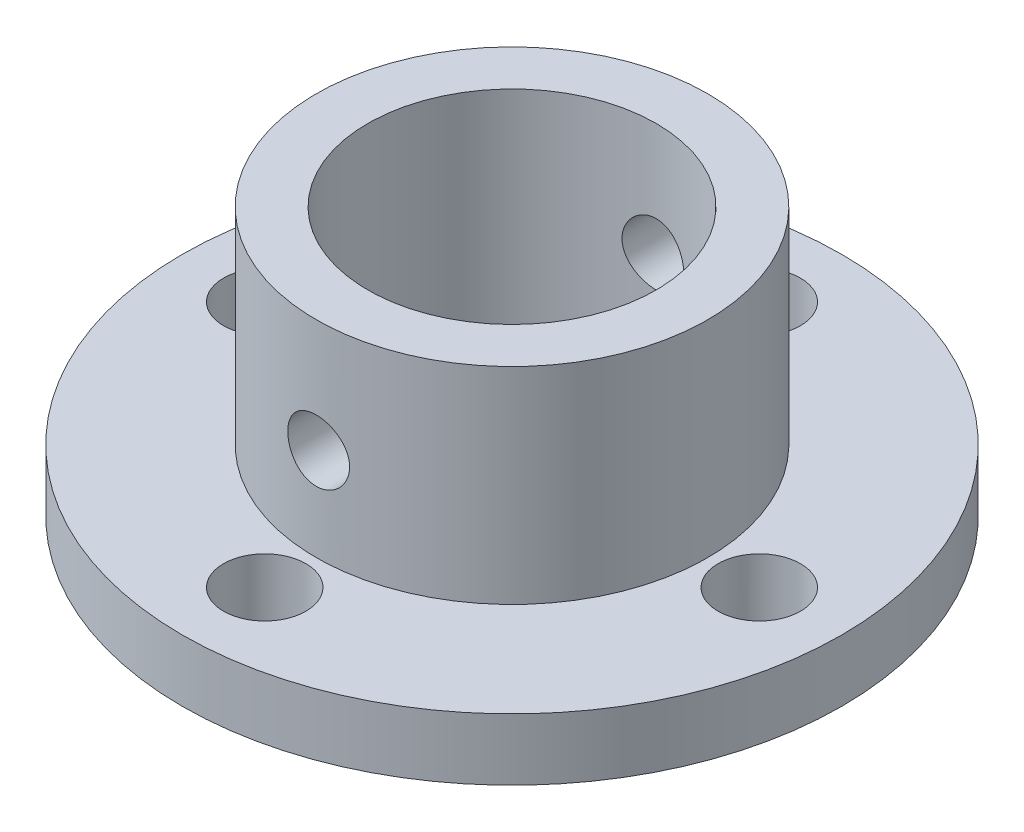
ISO-10303-21;
HEADER;
FILE_DESCRIPTION(('STEP AP214'),'2;1');
FILE_NAME('part.step','',(''),(''),'','','');
FILE_SCHEMA(('AUTOMOTIVE_DESIGN { 1 0 10303 214 1 1 1 1 }'));
ENDSEC;
DATA;
#1=APPLICATION_CONTEXT('core data for automotive mechanical design processes');
#2=APPLICATION_PROTOCOL_DEFINITION('international standard','automotive_design',2000,#1);
#3=PRODUCT_CONTEXT('',#1,'mechanical');
#4=PRODUCT('Part','Part','',(#3));
#5=PRODUCT_RELATED_PRODUCT_CATEGORY('part','',(#4));
#6=PRODUCT_DEFINITION_FORMATION('','',#4);
#7=PRODUCT_DEFINITION_CONTEXT('part definition',#1,'design');
#8=PRODUCT_DEFINITION('design','',#6,#7);
#9=PRODUCT_DEFINITION_SHAPE('','',#8);
#10=(LENGTH_UNIT() NAMED_UNIT(*) SI_UNIT(.MILLI.,.METRE.));
#11=(NAMED_UNIT(*) PLANE_ANGLE_UNIT() SI_UNIT($,.RADIAN.));
#12=(NAMED_UNIT(*) SI_UNIT($,.STERADIAN.) SOLID_ANGLE_UNIT());
#13=UNCERTAINTY_MEASURE_WITH_UNIT(LENGTH_MEASURE(1.E-05),#10,'distance_accuracy_value','');
#14=(GEOMETRIC_REPRESENTATION_CONTEXT(3) GLOBAL_UNCERTAINTY_ASSIGNED_CONTEXT((#13)) GLOBAL_UNIT_ASSIGNED_CONTEXT((#10,
#11,#12)) REPRESENTATION_CONTEXT('',''));
#15=CARTESIAN_POINT('',(0.,0.,0.));
#16=DIRECTION('',(0.,0.,1.));
#17=DIRECTION('',(1.,0.,0.));
#18=AXIS2_PLACEMENT_3D('',#15,#16,#17);
#19=CARTESIAN_POINT('',(0.,0.,0.));
#20=DIRECTION('',(0.,-1.,0.));
#21=DIRECTION('',(0.,0.,-1.));
#22=AXIS2_PLACEMENT_3D('',#19,#20,#21);
#23=CYLINDRICAL_SURFACE('',#22,7.);
#24=CARTESIAN_POINT('',(0.,9.,-7.));
#25=CARTESIAN_POINT('',(0.0832358860906165,8.9999971004257,-6.99999846043226));
#26=CARTESIAN_POINT('',(0.166507195600274,8.99304839161214,-6.9985002594971));
#27=CARTESIAN_POINT('',(0.330687344293327,8.96546434314641,-6.99266829827727));
#28=CARTESIAN_POINT('',(0.41159440357119,8.94481895580507,-6.98833245637099));
#29=CARTESIAN_POINT('',(0.568649323817737,8.89051563539197,-6.97730831788826));
#30=CARTESIAN_POINT('',(0.644801963446556,8.85687102061868,-6.97062242967171));
#31=CARTESIAN_POINT('',(0.790378177960787,8.77756591382874,-6.95562106817971));
#32=CARTESIAN_POINT('',(0.859801981747369,8.73190583075006,-6.9473056503666));
#33=CARTESIAN_POINT('',(0.991024790535229,8.62911970032649,-6.92981369246311));
#34=CARTESIAN_POINT('',(1.05270503419445,8.57184377810147,-6.92062683143259));
#35=CARTESIAN_POINT('',(1.16566042389435,8.4477736843148,-6.90250069814144));
#36=CARTESIAN_POINT('',(1.21693467150908,8.38097869174874,-6.8935614473163));
#37=CARTESIAN_POINT('',(1.30814204379808,8.23889424713957,-6.87684116047225));
#38=CARTESIAN_POINT('',(1.34794958335009,8.16352248224379,-6.8690733634436));
#39=CARTESIAN_POINT('',(1.41428823691148,8.00696554623316,-6.85572325558537));
#40=CARTESIAN_POINT('',(1.44082087001716,7.92578104150743,-6.85014069470711));
#41=CARTESIAN_POINT('',(1.47946574422454,7.76118891341193,-6.8418980892631));
#42=CARTESIAN_POINT('',(1.49178779748342,7.67783272433614,-6.83919556896486));
#43=CARTESIAN_POINT('',(1.50231395206577,7.51019576749301,-6.83689139845106));
#44=CARTESIAN_POINT('',(1.50051971664629,7.42591510982005,-6.83728938291729));
#45=CARTESIAN_POINT('',(1.48303326340861,7.26037531206621,-6.84110276603832));
#46=CARTESIAN_POINT('',(1.46758398649408,7.17908911089985,-6.84446541682162));
#47=CARTESIAN_POINT('',(1.42361054298677,7.02028975971066,-6.85374593375788));
#48=CARTESIAN_POINT('',(1.39508566936466,6.94277681396768,-6.85966393808402));
#49=CARTESIAN_POINT('',(1.32554551075991,6.79303712712666,-6.87344080755724));
#50=CARTESIAN_POINT('',(1.2844361097283,6.72085548728745,-6.88131420983365));
#51=CARTESIAN_POINT('',(1.19096007283993,6.58432483504204,-6.89810572501288));
#52=CARTESIAN_POINT('',(1.13859196103562,6.5199768513138,-6.90702397481896));
#53=CARTESIAN_POINT('',(1.0227954275532,6.3995406443266,-6.92512718393878));
#54=CARTESIAN_POINT('',(0.95916023396441,6.34365129341526,-6.93431383972178));
#55=CARTESIAN_POINT('',(0.823317306269097,6.24330626631034,-6.95175017497059));
#56=CARTESIAN_POINT('',(0.751109428775401,6.19885078139961,-6.95999983875972));
#57=CARTESIAN_POINT('',(0.59993346204996,6.12258932009307,-6.97465778534003));
#58=CARTESIAN_POINT('',(0.520952258863483,6.09080858742202,-6.98106238643354));
#59=CARTESIAN_POINT('',(0.358603146685707,6.04102435167891,-6.99128109245334));
#60=CARTESIAN_POINT('',(0.27523585113367,6.02301892743668,-6.99509555860384));
#61=CARTESIAN_POINT('',(0.10818767083663,6.00158378585658,-6.99965306347808));
#62=CARTESIAN_POINT('',(0.0245431772716159,5.99788228711822,-7.00045336521066));
#63=CARTESIAN_POINT('',(-0.142168973650404,6.00442457112516,-6.99905248935969));
#64=CARTESIAN_POINT('',(-0.225236668127254,6.01466744796294,-6.99685150675698));
#65=CARTESIAN_POINT('',(-0.387542537982805,6.0485822436617,-6.98973143045266));
#66=CARTESIAN_POINT('',(-0.466811712908476,6.07211236947253,-6.98484105045459));
#67=CARTESIAN_POINT('',(-0.620278450473417,6.13177694299482,-6.9728892442151));
#68=CARTESIAN_POINT('',(-0.694475592587739,6.16791243431165,-6.96582763822237));
#69=CARTESIAN_POINT('',(-0.836821397964753,6.25233354306033,-6.950175043904));
#70=CARTESIAN_POINT('',(-0.904872575111139,6.30077979490973,-6.94156431354275));
#71=CARTESIAN_POINT('',(-1.03197692552359,6.40823482488874,-6.92381033034847));
#72=CARTESIAN_POINT('',(-1.091028978692,6.46724491588744,-6.91466701142097));
#73=CARTESIAN_POINT('',(-1.19952711057989,6.59539737018713,-6.89668172706324));
#74=CARTESIAN_POINT('',(-1.24878537255156,6.6647000992221,-6.88784792221285));
#75=CARTESIAN_POINT('',(-1.3349641538604,6.81075459647799,-6.87166654559681));
#76=CARTESIAN_POINT('',(-1.37188519913706,6.88750604697749,-6.86431891048055));
#77=CARTESIAN_POINT('',(-1.43209741248548,7.0458722989946,-6.8520100980739));
#78=CARTESIAN_POINT('',(-1.45546398641275,7.12745735643067,-6.84703574582967));
#79=CARTESIAN_POINT('',(-1.48812696085335,7.29351558383364,-6.84001186708418));
#80=CARTESIAN_POINT('',(-1.49742550780258,7.37798831120132,-6.83796189439706));
#81=CARTESIAN_POINT('',(-1.5015999992604,7.54553234317524,-6.83704618848155));
#82=CARTESIAN_POINT('',(-1.49677347258311,7.62859601498058,-6.83811476518543));
#83=CARTESIAN_POINT('',(-1.47349789406331,7.79269724213259,-6.8431676318483));
#84=CARTESIAN_POINT('',(-1.45504898957979,7.87373481938657,-6.84715189026714));
#85=CARTESIAN_POINT('',(-1.40519345940434,8.03125865786916,-6.85755581104157));
#86=CARTESIAN_POINT('',(-1.37382847170887,8.10775864866429,-6.86396764224703));
#87=CARTESIAN_POINT('',(-1.29906751595601,8.25445537250685,-6.87850764590649));
#88=CARTESIAN_POINT('',(-1.255670353015,8.32465147861504,-6.88663598880362));
#89=CARTESIAN_POINT('',(-1.15708290349304,8.45821819372536,-6.90389055593232));
#90=CARTESIAN_POINT('',(-1.10167987421237,8.52142969594697,-6.91303309938926));
#91=CARTESIAN_POINT('',(-0.981086554619622,8.63775626252046,-6.93117449799694));
#92=CARTESIAN_POINT('',(-0.915894009385598,8.6908689943122,-6.94017331951296));
#93=CARTESIAN_POINT('',(-0.776603147268718,8.78611595950556,-6.95714491048987));
#94=CARTESIAN_POINT('',(-0.702404846009642,8.82810660623098,-6.96510364570626));
#95=CARTESIAN_POINT('',(-0.547850160940599,8.89895452890618,-6.97895826104019));
#96=CARTESIAN_POINT('',(-0.467499105863881,8.92782302258503,-6.98485590212342));
#97=CARTESIAN_POINT('',(-0.322535217553205,8.96635218513115,-6.99284848461772));
#98=CARTESIAN_POINT('',(-0.25871720554598,8.97894643398003,-6.99551391888263));
#99=CARTESIAN_POINT('',(-0.129939960853847,8.99577130171166,-6.99909024154719));
#100=CARTESIAN_POINT('',(-0.0649807750887453,9.00000226364606,-7.00000120191314));
#101=CARTESIAN_POINT('',(0.,9.,-7.));
#102=B_SPLINE_CURVE_WITH_KNOTS('',3,(#24,#25,#26,#27,#28,#29,#30,#31,#32,#33,#34,#35,#36,#37,
#38,#39,#40,#41,#42,#43,#44,#45,#46,#47,#48,#49,#50,#51,#52,#53,#54,#55,#56,#57,#58,#59,#60,#61,
#62,#63,#64,#65,#66,#67,#68,#69,#70,#71,#72,#73,#74,#75,#76,#77,#78,#79,#80,#81,#82,#83,#84,#85,
#86,#87,#88,#89,#90,#91,#92,#93,#94,#95,#96,#97,#98,#99,#100,#101),.UNSPECIFIED.,.T.,.F.,(4,2,2,
2,2,2,2,2,2,2,2,2,2,2,2,2,2,2,2,2,2,2,2,2,2,2,2,2,2,2,2,2,2,2,2,2,2,2,4),(0.,0.249469836512082,
0.499122883219935,0.748520824425602,0.997910278645886,1.25074961881732,1.50361077918506,
1.7591442921451,2.0146485567749,2.26633008124666,2.51798195169165,2.76524475452927,
3.01252092904568,3.26169356165968,3.51089887920889,3.76527011050291,4.0196455970235,
4.27452521139806,4.52936927256343,4.77934665704185,5.02930780231429,5.27665060589267,
5.52401389198434,5.77478733867803,6.02559197304485,6.28082063283534,6.53603841075805,
6.78982240408475,7.04356767229185,7.29200680540294,7.5404432510827,7.78808499706785,
8.03575134451623,8.28822950154113,8.54076590397115,8.79641910357222,9.0518533401027,
9.24661799132293,9.44137465337336),.UNSPECIFIED.);
#103=CARTESIAN_POINT('',(0.,9.,-7.));
#104=VERTEX_POINT('',#103);
#105=EDGE_CURVE('E102',#104,#104,#102,.T.);
#106=ORIENTED_EDGE('',*,*,#105,.T.);
#107=EDGE_LOOP('',(#106));
#108=FACE_BOUND('',#107,.T.);
#109=CARTESIAN_POINT('',(1.5,7.5,6.83739716558867));
#110=CARTESIAN_POINT('',(1.49999708238613,7.58321115248195,6.83739884558951));
#111=CARTESIAN_POINT('',(1.49305236244768,7.66645777394212,6.83893272341929));
#112=CARTESIAN_POINT('',(1.46548559252999,7.83058667224201,6.84489178429867));
#113=CARTESIAN_POINT('',(1.44485339653622,7.91146714867621,6.84931911211841));
#114=CARTESIAN_POINT('',(1.39058863684599,8.0684657495742,6.86054115293409));
#115=CARTESIAN_POINT('',(1.35697000991314,8.14458887812147,6.86733332725825));
#116=CARTESIAN_POINT('',(1.27772617673341,8.29011527394461,6.88251670848644));
#117=CARTESIAN_POINT('',(1.23210132048776,8.35951873702908,6.89090786877545));
#118=CARTESIAN_POINT('',(1.12935142570221,8.49076296148212,6.90849578796654));
#119=CARTESIAN_POINT('',(1.07206859483983,8.55247887623996,6.91770249871753));
#120=CARTESIAN_POINT('',(0.947969508129577,8.66550355440578,6.93579691710397));
#121=CARTESIAN_POINT('',(0.881152530217675,8.71681152886007,6.94468460051416));
#122=CARTESIAN_POINT('',(0.739047288464581,8.80805544449143,6.96124769109432));
#123=CARTESIAN_POINT('',(0.663680488229954,8.84787165577062,6.96890998819429));
#124=CARTESIAN_POINT('',(0.507134269342596,8.91422769144629,6.98204671042933));
#125=CARTESIAN_POINT('',(0.425955477380312,8.94076894478628,6.98752137103329));
#126=CARTESIAN_POINT('',(0.261387187671512,8.97942997093134,6.9955956528118));
#127=CARTESIAN_POINT('',(0.178049400596924,8.99176092855243,6.99823733378385));
#128=CARTESIAN_POINT('',(0.010448945306645,9.00231127731326,7.00049362207002));
#129=CARTESIAN_POINT('',(-0.073813620164759,9.00053222056076,7.00010856232698));
#130=CARTESIAN_POINT('',(-0.239417029250511,8.98307103533642,6.99638700862558));
#131=CARTESIAN_POINT('',(-0.320783115362112,8.96761649971008,6.99309883152432));
#132=CARTESIAN_POINT('',(-0.479739463978388,8.92360531814814,6.98399541589104));
#133=CARTESIAN_POINT('',(-0.557329560175054,8.89504809570026,6.97818006616518));
#134=CARTESIAN_POINT('',(-0.707167497556552,8.82543854111148,6.96459754646858));
#135=CARTESIAN_POINT('',(-0.779373657015788,8.78429923279565,6.95681685803946));
#136=CARTESIAN_POINT('',(-0.915940926562845,8.6907580318364,6.94015793743865));
#137=CARTESIAN_POINT('',(-0.980301006451528,8.6383546626997,6.93127956144693));
#138=CARTESIAN_POINT('',(-1.10070208800198,8.52253145547214,6.91319326460925));
#139=CARTESIAN_POINT('',(-1.1565511732025,8.45891242064297,6.90398230372853));
#140=CARTESIAN_POINT('',(-1.25682243234728,8.32311671493149,6.88643566831974));
#141=CARTESIAN_POINT('',(-1.30124432118068,8.25093983059475,6.87810001563386));
#142=CARTESIAN_POINT('',(-1.37748077573296,8.09977549893624,6.86324023586723));
#143=CARTESIAN_POINT('',(-1.40926035088923,8.02076987614756,6.85672115127775));
#144=CARTESIAN_POINT('',(-1.45903495159115,7.85836723405356,6.84630340806616));
#145=CARTESIAN_POINT('',(-1.47703206694628,7.77497088255681,6.84240435218483));
#146=CARTESIAN_POINT('',(-1.49843586024652,7.60790424735029,6.83774881255446));
#147=CARTESIAN_POINT('',(-1.5021214192864,7.5242713249227,6.83693227051701));
#148=CARTESIAN_POINT('',(-1.49555139642373,7.3575860068183,6.83837239573993));
#149=CARTESIAN_POINT('',(-1.48529673081635,7.27453357334645,6.84062886101063));
#150=CARTESIAN_POINT('',(-1.45137894635584,7.11232956501924,6.84790415484205));
#151=CARTESIAN_POINT('',(-1.42786830251553,7.03314456740304,6.85289155274364));
#152=CARTESIAN_POINT('',(-1.3682705294675,6.87983766246708,6.86503859869777));
#153=CARTESIAN_POINT('',(-1.33218223662818,6.80571622436581,6.87219844772849));
#154=CARTESIAN_POINT('',(-1.24783504416705,6.66343031524108,6.88801634080345));
#155=CARTESIAN_POINT('',(-1.19940368590792,6.59537041798781,6.89669501746317));
#156=CARTESIAN_POINT('',(-1.09197183833601,6.4682416541262,6.91451775360139));
#157=CARTESIAN_POINT('',(-1.03297009182161,6.40917385855153,6.92366186834461));
#158=CARTESIAN_POINT('',(-0.904812764420814,6.30062969705524,6.94158239990173));
#159=CARTESIAN_POINT('',(-0.835494925828771,6.25134308384299,6.95034935607746));
#160=CARTESIAN_POINT('',(-0.689401481282276,6.16511459064895,6.96635610714901));
#161=CARTESIAN_POINT('',(-0.61262621604374,6.12817214702717,6.97359597176692));
#162=CARTESIAN_POINT('',(-0.45426541898204,6.06794794536152,6.98569278381574));
#163=CARTESIAN_POINT('',(-0.372713193075173,6.04458169625372,6.99056443803698));
#164=CARTESIAN_POINT('',(-0.20672517700329,6.01190829426768,6.9974393930198));
#165=CARTESIAN_POINT('',(-0.122289789973994,6.00259918402609,6.99944309312296));
#166=CARTESIAN_POINT('',(0.0452637170528282,5.99838934758814,7.00034511009056));
#167=CARTESIAN_POINT('',(0.128374505509229,6.00320484139538,6.99930459001667));
#168=CARTESIAN_POINT('',(0.29257293841596,6.02647476351903,6.99436552363383));
#169=CARTESIAN_POINT('',(0.373660616405284,6.04492896557832,6.99046702473686));
#170=CARTESIAN_POINT('',(0.531301948487269,6.09481880624949,6.98025388638537));
#171=CARTESIAN_POINT('',(0.607868365073177,6.12621568938556,6.97394646430492));
#172=CARTESIAN_POINT('',(0.754684956723219,6.20106127116912,6.9595903605066));
#173=CARTESIAN_POINT('',(0.82493454479614,6.24451108830603,6.9515415172034));
#174=CARTESIAN_POINT('',(0.958512306895242,6.34316231874267,6.93439809934493));
#175=CARTESIAN_POINT('',(1.02169036510577,6.39856415832131,6.92528708907874));
#176=CARTESIAN_POINT('',(1.13795001457643,6.51914061025035,6.90713690075836));
#177=CARTESIAN_POINT('',(1.19102918062422,6.5843175633556,6.89809774045682));
#178=CARTESIAN_POINT('',(1.28623261596675,6.72359049318567,6.88098693651915));
#179=CARTESIAN_POINT('',(1.32820897809616,6.79778935828702,6.87292905956533));
#180=CARTESIAN_POINT('',(1.39903004659825,6.95234372092325,6.85886497228049));
#181=CARTESIAN_POINT('',(1.42788606423931,7.03269384525307,6.85285699581573));
#182=CARTESIAN_POINT('',(1.46638607121557,7.17762613118586,6.84470560641996));
#183=CARTESIAN_POINT('',(1.47896752507743,7.24141167570783,6.84198283087953));
#184=CARTESIAN_POINT('',(1.49577544043437,7.37012431157732,6.83832799504405));
#185=CARTESIAN_POINT('',(1.50000227727981,7.43505135150832,6.83739585430069));
#186=CARTESIAN_POINT('',(1.5,7.5,6.83739716558867));
#187=B_SPLINE_CURVE_WITH_KNOTS('',3,(#109,#110,#111,#112,#113,#114,#115,#116,#117,#118,#119,
#120,#121,#122,#123,#124,#125,#126,#127,#128,#129,#130,#131,#132,#133,#134,#135,#136,#137,#138,
#139,#140,#141,#142,#143,#144,#145,#146,#147,#148,#149,#150,#151,#152,#153,#154,#155,#156,#157,
#158,#159,#160,#161,#162,#163,#164,#165,#166,#167,#168,#169,#170,#171,#172,#173,#174,#175,#176,
#177,#178,#179,#180,#181,#182,#183,#184,#185,#186),.UNSPECIFIED.,.T.,.F.,(4,2,2,2,2,2,2,2,2,2,2,
2,2,2,2,2,2,2,2,2,2,2,2,2,2,2,2,2,2,2,2,2,2,2,2,2,2,2,4),(0.,0.249395482027528,
0.498976038479964,0.748289491152758,0.997595676735284,1.25053229582692,1.50348808112879,
1.75899134820278,2.01446710646267,2.26609508151929,2.51769537777241,2.76518557667371,
3.01268666607584,3.26193888143437,3.51122378872315,3.76548960779295,4.01976177023092,
4.27473287411781,4.52966530953839,4.77960433192523,5.02952692653917,5.27663180749375,
5.5237595556315,5.77455010216318,6.02537049659078,6.2806621468321,6.53594213875541,
6.78961589824375,7.04325433208539,7.29183199644127,7.540405537151,7.78824009619483,
8.03609766151365,8.28848914160965,8.54094115631233,8.79660380167249,9.05204561611687,
9.24671456122272,9.44137476018023),.UNSPECIFIED.);
#188=CARTESIAN_POINT('',(1.5,7.5,6.83739716558867));
#189=VERTEX_POINT('',#188);
#190=EDGE_CURVE('E95',#189,#189,#187,.T.);
#191=ORIENTED_EDGE('',*,*,#190,.T.);
#192=EDGE_LOOP('',(#191));
#193=FACE_BOUND('',#192,.T.);
#194=CARTESIAN_POINT('',(0.,13.,0.));
#195=DIRECTION('',(0.,-1.,0.));
#196=DIRECTION('',(0.,0.,-1.));
#197=AXIS2_PLACEMENT_3D('',#194,#195,#196);
#198=CIRCLE('',#197,7.);
#199=CARTESIAN_POINT('',(0.,13.,-7.));
#200=VERTEX_POINT('',#199);
#201=EDGE_CURVE('E111',#200,#200,#198,.T.);
#202=ORIENTED_EDGE('',*,*,#201,.F.);
#203=EDGE_LOOP('',(#202));
#204=FACE_BOUND('',#203,.T.);
#205=CARTESIAN_POINT('',(0.,0.,0.));
#206=DIRECTION('',(0.,-1.,0.));
#207=DIRECTION('',(0.,0.,-1.));
#208=AXIS2_PLACEMENT_3D('',#205,#206,#207);
#209=CIRCLE('',#208,7.);
#210=CARTESIAN_POINT('',(0.,0.,-7.));
#211=VERTEX_POINT('',#210);
#212=EDGE_CURVE('E10',#211,#211,#209,.T.);
#213=ORIENTED_EDGE('',*,*,#212,.T.);
#214=EDGE_LOOP('',(#213));
#215=FACE_BOUND('',#214,.T.);
#216=ADVANCED_FACE('F43',(#108,#193,#204,#215),#23,.F.);
#217=CARTESIAN_POINT('',(0.,0.,7.));
#218=DIRECTION('',(0.,1.,0.));
#219=DIRECTION('',(0.,0.,1.));
#220=AXIS2_PLACEMENT_3D('',#217,#218,#219);
#221=PLANE('',#220);
#222=CARTESIAN_POINT('',(-12.,0.,0.));
#223=DIRECTION('',(0.,1.,0.));
#224=DIRECTION('',(-1.,0.,0.));
#225=AXIS2_PLACEMENT_3D('',#222,#223,#224);
#226=CIRCLE('',#225,2.);
#227=CARTESIAN_POINT('',(-14.,0.,0.));
#228=VERTEX_POINT('',#227);
#229=EDGE_CURVE('E249',#228,#228,#226,.T.);
#230=ORIENTED_EDGE('',*,*,#229,.T.);
#231=EDGE_LOOP('',(#230));
#232=FACE_BOUND('',#231,.T.);
#233=CARTESIAN_POINT('',(0.,0.,-12.));
#234=DIRECTION('',(0.,1.,0.));
#235=DIRECTION('',(0.,0.,-1.));
#236=AXIS2_PLACEMENT_3D('',#233,#234,#235);
#237=CIRCLE('',#236,2.);
#238=CARTESIAN_POINT('',(0.,0.,-14.));
#239=VERTEX_POINT('',#238);
#240=EDGE_CURVE('E276',#239,#239,#237,.T.);
#241=ORIENTED_EDGE('',*,*,#240,.T.);
#242=EDGE_LOOP('',(#241));
#243=FACE_BOUND('',#242,.T.);
#244=CARTESIAN_POINT('',(12.,0.,1.25693328198353E-13));
#245=DIRECTION('',(0.,1.,0.));
#246=DIRECTION('',(1.,0.,0.));
#247=AXIS2_PLACEMENT_3D('',#244,#245,#246);
#248=CIRCLE('',#247,2.);
#249=CARTESIAN_POINT('',(14.,0.,1.46642216231412E-13));
#250=VERTEX_POINT('',#249);
#251=EDGE_CURVE('E280',#250,#250,#248,.T.);
#252=ORIENTED_EDGE('',*,*,#251,.T.);
#253=EDGE_LOOP('',(#252));
#254=FACE_BOUND('',#253,.T.);
#255=CARTESIAN_POINT('',(0.,0.,12.));
#256=DIRECTION('',(0.,1.,0.));
#257=DIRECTION('',(0.,0.,1.));
#258=AXIS2_PLACEMENT_3D('',#255,#256,#257);
#259=CIRCLE('',#258,2.);
#260=CARTESIAN_POINT('',(0.,0.,14.));
#261=VERTEX_POINT('',#260);
#262=EDGE_CURVE('E103',#261,#261,#259,.T.);
#263=ORIENTED_EDGE('',*,*,#262,.T.);
#264=EDGE_LOOP('',(#263));
#265=FACE_BOUND('',#264,.T.);
#266=ORIENTED_EDGE('',*,*,#212,.F.);
#267=EDGE_LOOP('',(#266));
#268=FACE_BOUND('',#267,.T.);
#269=CARTESIAN_POINT('',(0.,0.,0.));
#270=DIRECTION('',(0.,-1.,0.));
#271=DIRECTION('',(0.,0.,-1.));
#272=AXIS2_PLACEMENT_3D('',#269,#270,#271);
#273=CIRCLE('',#272,16.);
#274=CARTESIAN_POINT('',(0.,0.,-16.));
#275=VERTEX_POINT('',#274);
#276=EDGE_CURVE('E52',#275,#275,#273,.T.);
#277=ORIENTED_EDGE('',*,*,#276,.T.);
#278=EDGE_LOOP('',(#277));
#279=FACE_BOUND('',#278,.T.);
#280=ADVANCED_FACE('F144',(#232,#243,#254,#265,#268,#279),#221,.F.);
#281=CARTESIAN_POINT('',(0.,0.,0.));
#282=DIRECTION('',(0.,-1.,0.));
#283=DIRECTION('',(0.,0.,-1.));
#284=AXIS2_PLACEMENT_3D('',#281,#282,#283);
#285=CYLINDRICAL_SURFACE('',#284,16.);
#286=ORIENTED_EDGE('',*,*,#276,.F.);
#287=EDGE_LOOP('',(#286));
#288=FACE_BOUND('',#287,.T.);
#289=CARTESIAN_POINT('',(0.,3.,0.));
#290=DIRECTION('',(0.,-1.,0.));
#291=DIRECTION('',(0.,0.,-1.));
#292=AXIS2_PLACEMENT_3D('',#289,#290,#291);
#293=CIRCLE('',#292,16.);
#294=CARTESIAN_POINT('',(0.,3.,-16.));
#295=VERTEX_POINT('',#294);
#296=EDGE_CURVE('E58',#295,#295,#293,.T.);
#297=ORIENTED_EDGE('',*,*,#296,.T.);
#298=EDGE_LOOP('',(#297));
#299=FACE_BOUND('',#298,.T.);
#300=ADVANCED_FACE('F126',(#288,#299),#285,.T.);
#301=CARTESIAN_POINT('',(0.,3.,16.));
#302=DIRECTION('',(0.,-1.,0.));
#303=DIRECTION('',(0.,0.,-1.));
#304=AXIS2_PLACEMENT_3D('',#301,#302,#303);
#305=PLANE('',#304);
#306=CARTESIAN_POINT('',(-12.,3.,0.));
#307=DIRECTION('',(0.,-1.,0.));
#308=DIRECTION('',(0.,0.,-1.));
#309=AXIS2_PLACEMENT_3D('',#306,#307,#308);
#310=CIRCLE('',#309,2.);
#311=CARTESIAN_POINT('',(-12.,3.,-2.00000000000004));
#312=VERTEX_POINT('',#311);
#313=EDGE_CURVE('E47',#312,#312,#310,.T.);
#314=ORIENTED_EDGE('',*,*,#313,.T.);
#315=EDGE_LOOP('',(#314));
#316=FACE_BOUND('',#315,.T.);
#317=CARTESIAN_POINT('',(0.,3.,-12.));
#318=DIRECTION('',(0.,-1.,0.));
#319=DIRECTION('',(0.,0.,-1.));
#320=AXIS2_PLACEMENT_3D('',#317,#318,#319);
#321=CIRCLE('',#320,2.);
#322=CARTESIAN_POINT('',(0.,3.,-14.));
#323=VERTEX_POINT('',#322);
#324=EDGE_CURVE('E253',#323,#323,#321,.T.);
#325=ORIENTED_EDGE('',*,*,#324,.T.);
#326=EDGE_LOOP('',(#325));
#327=FACE_BOUND('',#326,.T.);
#328=CARTESIAN_POINT('',(12.,3.,1.25693328198353E-13));
#329=DIRECTION('',(0.,-1.,0.));
#330=DIRECTION('',(0.,0.,-1.));
#331=AXIS2_PLACEMENT_3D('',#328,#329,#330);
#332=CIRCLE('',#331,2.);
#333=CARTESIAN_POINT('',(12.,3.,-1.99999999999987));
#334=VERTEX_POINT('',#333);
#335=EDGE_CURVE('E258',#334,#334,#332,.T.);
#336=ORIENTED_EDGE('',*,*,#335,.T.);
#337=EDGE_LOOP('',(#336));
#338=FACE_BOUND('',#337,.T.);
#339=CARTESIAN_POINT('',(0.,3.,12.));
#340=DIRECTION('',(0.,-1.,0.));
#341=DIRECTION('',(0.,0.,-1.));
#342=AXIS2_PLACEMENT_3D('',#339,#340,#341);
#343=CIRCLE('',#342,2.);
#344=CARTESIAN_POINT('',(0.,3.,10.));
#345=VERTEX_POINT('',#344);
#346=EDGE_CURVE('E72',#345,#345,#343,.T.);
#347=ORIENTED_EDGE('',*,*,#346,.T.);
#348=EDGE_LOOP('',(#347));
#349=FACE_BOUND('',#348,.T.);
#350=ORIENTED_EDGE('',*,*,#296,.F.);
#351=EDGE_LOOP('',(#350));
#352=FACE_BOUND('',#351,.T.);
#353=CARTESIAN_POINT('',(0.,3.,0.));
#354=DIRECTION('',(0.,-1.,0.));
#355=DIRECTION('',(0.,0.,-1.));
#356=AXIS2_PLACEMENT_3D('',#353,#354,#355);
#357=CIRCLE('',#356,9.5);
#358=CARTESIAN_POINT('',(0.,3.,-9.5));
#359=VERTEX_POINT('',#358);
#360=EDGE_CURVE('E119',#359,#359,#357,.T.);
#361=ORIENTED_EDGE('',*,*,#360,.T.);
#362=EDGE_LOOP('',(#361));
#363=FACE_BOUND('',#362,.T.);
#364=ADVANCED_FACE('F128',(#316,#327,#338,#349,#352,#363),#305,.F.);
#365=CARTESIAN_POINT('',(0.,0.,0.));
#366=DIRECTION('',(0.,-1.,0.));
#367=DIRECTION('',(0.,0.,-1.));
#368=AXIS2_PLACEMENT_3D('',#365,#366,#367);
#369=CYLINDRICAL_SURFACE('',#368,9.5);
#370=CARTESIAN_POINT('',(0.,9.,-9.5));
#371=CARTESIAN_POINT('',(-0.0836976001065212,8.99999659075089,-9.49999861203618));
#372=CARTESIAN_POINT('',(-0.167442437394015,8.99297105489717,-9.49888234231911));
#373=CARTESIAN_POINT('',(-0.332587635211273,8.96506375653031,-9.49453678011783));
#374=CARTESIAN_POINT('',(-0.41398569489526,8.94416884792844,-9.49130548294469));
#375=CARTESIAN_POINT('',(-0.572023766729428,8.88916582150304,-9.48309267200424));
#376=CARTESIAN_POINT('',(-0.6486674574046,8.85506807066557,-9.47811253172855));
#377=CARTESIAN_POINT('',(-0.795134710469113,8.77465345446147,-9.46695108120927));
#378=CARTESIAN_POINT('',(-0.864959141108909,8.72833814746046,-9.46076992418342));
#379=CARTESIAN_POINT('',(-0.996418466512017,8.62437811450022,-9.44783324384052));
#380=CARTESIAN_POINT('',(-1.05798606000114,8.56664878123631,-9.44107365911176));
#381=CARTESIAN_POINT('',(-1.17060304704613,8.44168151829407,-9.42777343334239));
#382=CARTESIAN_POINT('',(-1.22165180906462,8.37444301810582,-9.42123280546741));
#383=CARTESIAN_POINT('',(-1.31204764005015,8.23190915553054,-9.40907168619827));
#384=CARTESIAN_POINT('',(-1.35132892424659,8.1565715852408,-9.40345644380092));
#385=CARTESIAN_POINT('',(-1.41665421811941,8.00026432521204,-9.39383775862892));
#386=CARTESIAN_POINT('',(-1.44269902834657,7.91929497642356,-9.38983421838048));
#387=CARTESIAN_POINT('',(-1.4806016253586,7.75473305104834,-9.38393240557449));
#388=CARTESIAN_POINT('',(-1.49257509267669,7.67116774521641,-9.38201697623701));
#389=CARTESIAN_POINT('',(-1.50235362805524,7.50319382694182,-9.38045626095234));
#390=CARTESIAN_POINT('',(-1.50015959652364,7.41878526843207,-9.38081083073655));
#391=CARTESIAN_POINT('',(-1.48175980710843,7.25234202844382,-9.38373437383502));
#392=CARTESIAN_POINT('',(-1.46568339888114,7.17029263670841,-9.38628290415411));
#393=CARTESIAN_POINT('',(-1.4201779253579,7.01007060392592,-9.39327524902392));
#394=CARTESIAN_POINT('',(-1.39074844516594,6.93189808342161,-9.39771912246498));
#395=CARTESIAN_POINT('',(-1.3192392577636,6.78125818725081,-9.40802379337809));
#396=CARTESIAN_POINT('',(-1.27710525865785,6.70881701561895,-9.41389065039576));
#397=CARTESIAN_POINT('',(-1.1814216728908,6.57198394790952,-9.42637594353948));
#398=CARTESIAN_POINT('',(-1.12787125747699,6.50759263673453,-9.43299443421261));
#399=CARTESIAN_POINT('',(-1.01016734202821,6.38793788340068,-9.44632735425788));
#400=CARTESIAN_POINT('',(-0.945902736525759,6.33278370453035,-9.45304203303564));
#401=CARTESIAN_POINT('',(-0.808972007834444,6.23402607857166,-9.46574266984972));
#402=CARTESIAN_POINT('',(-0.73630584030216,6.19042269245236,-9.47172862403949));
#403=CARTESIAN_POINT('',(-0.584536306884603,6.11599678624987,-9.48230461469925));
#404=CARTESIAN_POINT('',(-0.505428458120266,6.08518325936849,-9.48689366833474));
#405=CARTESIAN_POINT('',(-0.343072096390924,6.03730969299786,-9.49415073946819));
#406=CARTESIAN_POINT('',(-0.259823894418548,6.02024862217756,-9.49681890101704));
#407=CARTESIAN_POINT('',(-0.0924923680310962,6.0005108630843,-9.49991434597553));
#408=CARTESIAN_POINT('',(-0.00842716740136934,5.99768406157555,-9.50036501369999));
#409=CARTESIAN_POINT('',(0.158976265712539,6.00609582484365,-9.49903852875433));
#410=CARTESIAN_POINT('',(0.242314523112227,6.01733390563322,-9.4972614527432));
#411=CARTESIAN_POINT('',(0.405439567370636,6.05343158131569,-9.49169362069365));
#412=CARTESIAN_POINT('',(0.48524306279508,6.07821749557923,-9.48791376028194));
#413=CARTESIAN_POINT('',(0.639561861197124,6.14062916757298,-9.47876264558505));
#414=CARTESIAN_POINT('',(0.714076892756961,6.17825558373644,-9.4733913096943));
#415=CARTESIAN_POINT('',(0.856359938682377,6.2656284951105,-9.4615955819989));
#416=CARTESIAN_POINT('',(0.924069207311129,6.31546954378735,-9.45516310943481));
#417=CARTESIAN_POINT('',(1.05021609132263,6.42572600258905,-9.44198475905152));
#418=CARTESIAN_POINT('',(1.10865310573566,6.48614209758918,-9.43523886095462));
#419=CARTESIAN_POINT('',(1.21514760920431,6.61650426556287,-9.42211913600069));
#420=CARTESIAN_POINT('',(1.26310409838576,6.68653331358802,-9.41574932753235));
#421=CARTESIAN_POINT('',(1.34657266649327,6.83374131226607,-9.40417594303638));
#422=CARTESIAN_POINT('',(1.38208510941917,6.91092005370034,-9.39897233289797));
#423=CARTESIAN_POINT('',(1.43950349612765,7.06994411093857,-9.39035010587674));
#424=CARTESIAN_POINT('',(1.46146126125825,7.15177033116238,-9.38692469878068));
#425=CARTESIAN_POINT('',(1.49131110199775,7.31800766724035,-9.38222912838246));
#426=CARTESIAN_POINT('',(1.49920426388363,7.40241858295376,-9.38095879863367));
#427=CARTESIAN_POINT('',(1.5006729373316,7.57042167299111,-9.38072387634563));
#428=CARTESIAN_POINT('',(1.49440732883688,7.65401246558048,-9.38173369742788));
#429=CARTESIAN_POINT('',(1.46807821019621,7.81893513302053,-9.38588947240367));
#430=CARTESIAN_POINT('',(1.44801473210917,7.90026701311925,-9.38903542133398));
#431=CARTESIAN_POINT('',(1.39471776903661,8.05831106484561,-9.39709967714348));
#432=CARTESIAN_POINT('',(1.3614965806929,8.13502747300764,-9.40201632881049));
#433=CARTESIAN_POINT('',(1.28284324745908,8.28182356832539,-9.41306982252277));
#434=CARTESIAN_POINT('',(1.23741059974182,8.3519029820311,-9.41920671481075));
#435=CARTESIAN_POINT('',(1.13505145080215,8.48424096806291,-9.4320909582884));
#436=CARTESIAN_POINT('',(1.07800762728681,8.54640824158857,-9.43884411780419));
#437=CARTESIAN_POINT('',(0.954293245344264,8.66034348055255,-9.45215249855795));
#438=CARTESIAN_POINT('',(0.887620460616888,8.71210903438498,-9.45870767359521));
#439=CARTESIAN_POINT('',(0.746056649485087,8.8040585652105,-9.47092780190555));
#440=CARTESIAN_POINT('',(0.671117681090891,8.84416948717269,-9.47658704267683));
#441=CARTESIAN_POINT('',(0.515509688205495,8.91117359654583,-9.48632189921254));
#442=CARTESIAN_POINT('',(0.434846589899647,8.93808023226726,-9.49039912533837));
#443=CARTESIAN_POINT('',(0.294869549677871,8.9719290910522,-9.4955986667772));
#444=CARTESIAN_POINT('',(0.236411965071405,8.98243924191617,-9.49724053176745));
#445=CARTESIAN_POINT('',(0.118644158414182,8.99647585408426,-9.49944168248486));
#446=CARTESIAN_POINT('',(0.05933394876298,9.00000241684602,-9.50000098393949));
#447=CARTESIAN_POINT('',(0.,9.,-9.5));
#448=B_SPLINE_CURVE_WITH_KNOTS('',3,(#370,#371,#372,#373,#374,#375,#376,#377,#378,#379,#380,
#381,#382,#383,#384,#385,#386,#387,#388,#389,#390,#391,#392,#393,#394,#395,#396,#397,#398,#399,
#400,#401,#402,#403,#404,#405,#406,#407,#408,#409,#410,#411,#412,#413,#414,#415,#416,#417,#418,
#419,#420,#421,#422,#423,#424,#425,#426,#427,#428,#429,#430,#431,#432,#433,#434,#435,#436,#437,
#438,#439,#440,#441,#442,#443,#444,#445,#446,#447),.UNSPECIFIED.,.T.,.F.,(4,2,2,2,2,2,2,2,2,2,2,
2,2,2,2,2,2,2,2,2,2,2,2,2,2,2,2,2,2,2,2,2,2,2,2,2,2,2,4),(0.,0.250875955706268,
0.501990044469083,0.752907354824667,1.00379267580462,1.25661257446513,1.50944764769345,
1.76367086508286,2.0178787050521,2.26998174901985,2.52206877086913,2.77183199835411,
3.02160298681438,3.27245685757923,3.52332894479686,3.77698595667627,4.03064430741767,
4.28448071735229,4.53829808968867,4.78943303847652,5.0405593456862,5.2903332848928,
5.54012003389346,5.79190509693548,6.04370647245532,6.2978367744557,6.55195964228958,
6.80510484781958,7.05823050087969,7.30852987505233,7.55882866766463,7.80889409144677,
8.05896981366678,8.31171040651354,8.56450952903007,8.81886068521234,9.07295224922779,
9.25080295634069,9.42865107961775),.UNSPECIFIED.);
#449=CARTESIAN_POINT('',(0.,9.,-9.5));
#450=VERTEX_POINT('',#449);
#451=EDGE_CURVE('E71',#450,#450,#448,.T.);
#452=ORIENTED_EDGE('',*,*,#451,.T.);
#453=EDGE_LOOP('',(#452));
#454=FACE_BOUND('',#453,.T.);
#455=CARTESIAN_POINT('',(1.5,7.5,9.38083151964686));
#456=CARTESIAN_POINT('',(1.49999658455055,7.41630973099396,9.38083297404067));
#457=CARTESIAN_POINT('',(1.49297223784084,7.33257220576043,9.38196360092028));
#458=CARTESIAN_POINT('',(1.46507009131938,7.16744219630707,9.38636039550341));
#459=CARTESIAN_POINT('',(1.44417911871311,7.08605201877025,9.38962859377943));
#460=CARTESIAN_POINT('',(1.38918760267279,6.92803062681524,9.39792135372632));
#461=CARTESIAN_POINT('',(1.35509761216466,6.85139566713861,9.40294451195283));
#462=CARTESIAN_POINT('',(1.27470128030859,6.70494308976448,9.414179545352));
#463=CARTESIAN_POINT('',(1.22839647880733,6.63512461427336,9.42039127066217));
#464=CARTESIAN_POINT('',(1.12444713836387,6.50365875591276,9.43336503838525));
#465=CARTESIAN_POINT('',(1.06671563821398,6.44208051568652,9.44013105201472));
#466=CARTESIAN_POINT('',(0.941739545888722,6.32944292542735,9.45341567106039));
#467=CARTESIAN_POINT('',(0.874494412511277,6.2783841742228,9.45993426237471));
#468=CARTESIAN_POINT('',(0.731954548292163,6.18797774403544,9.47203134599669));
#469=CARTESIAN_POINT('',(0.656618750818359,6.1486940570074,9.47760463238818));
#470=CARTESIAN_POINT('',(0.500315336961972,6.08336383437469,9.48713906529767));
#471=CARTESIAN_POINT('',(0.419348049999344,6.05731652523315,9.49110030602129));
#472=CARTESIAN_POINT('',(0.254793214503931,6.01940893218676,9.49693629805995));
#473=CARTESIAN_POINT('',(0.171232996932501,6.00743267318387,9.4988280968723));
#474=CARTESIAN_POINT('',(0.0032690989388912,5.99764679053478,9.5003705446193));
#475=CARTESIAN_POINT('',(-0.0811345294603305,5.999836298441,9.50002133094165));
#476=CARTESIAN_POINT('',(-0.247597304848641,6.01822877182066,9.49713466336619));
#477=CARTESIAN_POINT('',(-0.3296706258939,6.03430694775938,9.49461669627846));
#478=CARTESIAN_POINT('',(-0.489939598315299,6.07982419167056,9.48769715323518));
#479=CARTESIAN_POINT('',(-0.568135141212465,6.10926363318438,9.48329552461823));
#480=CARTESIAN_POINT('',(-0.718803540216121,6.18079375615291,9.47306987014884));
#481=CARTESIAN_POINT('',(-0.791251288178859,6.22293645712551,9.46724001448607));
#482=CARTESIAN_POINT('',(-0.928093849593965,6.31863878352674,9.45480671150477));
#483=CARTESIAN_POINT('',(-0.992488076174237,6.37219924021597,9.44820320787719));
#484=CARTESIAN_POINT('',(-1.1121320674923,6.48991047611401,9.43487320037046));
#485=CARTESIAN_POINT('',(-1.16727457805414,6.55417026276977,9.42814614020982));
#486=CARTESIAN_POINT('',(-1.266010929629,6.6910871241671,9.41539709463342));
#487=CARTESIAN_POINT('',(-1.30960468415935,6.76374426178624,9.40937511449785));
#488=CARTESIAN_POINT('',(-1.38402357522716,6.91551094643708,9.39871800561222));
#489=CARTESIAN_POINT('',(-1.4148368179779,6.99462642215888,9.3940841698043));
#490=CARTESIAN_POINT('',(-1.46270749784294,7.15699942059068,9.38675017598398));
#491=CARTESIAN_POINT('',(-1.47976601505946,7.24025661752309,9.38404986614158));
#492=CARTESIAN_POINT('',(-1.49949411042943,7.40759295565884,9.3809177353356));
#493=CARTESIAN_POINT('',(-1.50231612080203,7.49165369121823,9.38046188392375));
#494=CARTESIAN_POINT('',(-1.4938963689811,7.65904705893304,9.38180638869071));
#495=CARTESIAN_POINT('',(-1.48265509215639,7.7423797161168,9.38360666700331));
#496=CARTESIAN_POINT('',(-1.44655746438407,7.90547366936269,9.38923845197488));
#497=CARTESIAN_POINT('',(-1.42177781446732,7.98525237171346,9.39305851175889));
#498=CARTESIAN_POINT('',(-1.35938693205191,8.13952434071611,9.4022899197254));
#499=CARTESIAN_POINT('',(-1.3217750034913,8.21401732038944,9.40770135422673));
#500=CARTESIAN_POINT('',(-1.23442398163625,8.35628431531696,9.41956203589073));
#501=CARTESIAN_POINT('',(-1.18458667109844,8.42399732560537,9.42601953670219));
#502=CARTESIAN_POINT('',(-1.07433532022963,8.55015348859258,9.43922022959441));
#503=CARTESIAN_POINT('',(-1.01392061491125,8.60859605802997,9.44596343961713));
#504=CARTESIAN_POINT('',(-0.883556250112781,8.71510403793331,9.45905128553892));
#505=CARTESIAN_POINT('',(-0.813523322567929,8.76306813376324,9.46539164279549));
#506=CARTESIAN_POINT('',(-0.666305394879818,8.84655003122935,9.47689193046182));
#507=CARTESIAN_POINT('',(-0.58912060734501,8.88206820270442,9.48205189594613));
#508=CARTESIAN_POINT('',(-0.430099180755794,8.93949008017602,9.49059133505206));
#509=CARTESIAN_POINT('',(-0.348282544696111,8.96144808189547,9.49397790107198));
#510=CARTESIAN_POINT('',(-0.182065541000522,8.99130163797043,9.49861883842448));
#511=CARTESIAN_POINT('',(-0.0976653637496341,8.9991982260071,9.49987336648691));
#512=CARTESIAN_POINT('',(0.0703424890561669,9.00067748611935,9.50010700904781));
#513=CARTESIAN_POINT('',(0.153948809855683,8.99441477380159,9.49911070212592));
#514=CARTESIAN_POINT('',(0.31890328859377,8.968086009826,9.49500446266303));
#515=CARTESIAN_POINT('',(0.400251456141508,8.94802001691492,9.4918945391176));
#516=CARTESIAN_POINT('',(0.558330315524417,8.89471123864075,9.48390902705529));
#517=CARTESIAN_POINT('',(0.6350650844738,8.86148029105045,9.47903502511628));
#518=CARTESIAN_POINT('',(0.78189387143712,8.78280171307417,9.46805518209959));
#519=CARTESIAN_POINT('',(0.851987627392476,8.73735360086246,9.46194929244058));
#520=CARTESIAN_POINT('',(0.984326499290178,8.63497672363849,9.44910438099924));
#521=CARTESIAN_POINT('',(1.04648306132953,8.57793421566818,9.44235947063351));
#522=CARTESIAN_POINT('',(1.16039729972464,8.45422696693537,9.42903896923987));
#523=CARTESIAN_POINT('',(1.21215253557012,8.387559974227,9.42246341826432));
#524=CARTESIAN_POINT('',(1.30409009743288,8.24600156851814,9.4101817273596));
#525=CARTESIAN_POINT('',(1.34419772972858,8.17106115068598,9.40448130469082));
#526=CARTESIAN_POINT('',(1.41119529560835,8.01545024774828,9.39466254048804));
#527=CARTESIAN_POINT('',(1.43809871074204,7.93478570374299,9.39054258623338));
#528=CARTESIAN_POINT('',(1.47193913254666,7.79481712821115,9.38528558640041));
#529=CARTESIAN_POINT('',(1.48244550005068,7.73637003401573,9.38362436450214));
#530=CARTESIAN_POINT('',(1.49647709113171,7.61862319936654,9.38139682399236));
#531=CARTESIAN_POINT('',(1.50000242102602,7.55932347191174,9.38083048870633));
#532=CARTESIAN_POINT('',(1.5,7.5,9.38083151964686));
#533=B_SPLINE_CURVE_WITH_KNOTS('',3,(#455,#456,#457,#458,#459,#460,#461,#462,#463,#464,#465,
#466,#467,#468,#469,#470,#471,#472,#473,#474,#475,#476,#477,#478,#479,#480,#481,#482,#483,#484,
#485,#486,#487,#488,#489,#490,#491,#492,#493,#494,#495,#496,#497,#498,#499,#500,#501,#502,#503,
#504,#505,#506,#507,#508,#509,#510,#511,#512,#513,#514,#515,#516,#517,#518,#519,#520,#521,#522,
#523,#524,#525,#526,#527,#528,#529,#530,#531,#532),.UNSPECIFIED.,.T.,.F.,(4,2,2,2,2,2,2,2,2,2,2,
2,2,2,2,2,2,2,2,2,2,2,2,2,2,2,2,2,2,2,2,2,2,2,2,2,2,2,4),(0.,0.250853927262166,
0.501946498416268,0.752838728320957,1.00369934487581,1.25654807889771,1.50941120251429,
1.76362459165417,2.01782312279828,2.26991148848838,2.52198439977627,2.77181572176523,
3.02165402872708,3.27252964579772,3.52342353390932,3.77705047333307,4.03067931198404,
4.28454365571369,4.53838806257511,4.78950866646251,5.04062060361752,5.29032441173719,
5.54004176670728,5.79183509438419,6.04364425767606,6.29778980620821,6.5519278019965,
6.8050415020287,7.05813659442522,7.30848132386849,7.55882498785123,7.80894405482682,
8.05907298755212,8.31178569360908,8.56455762574338,8.81891644248641,9.07301501496295,
9.25083440456604,9.42865108605878),.UNSPECIFIED.);
#534=CARTESIAN_POINT('',(1.5,7.5,9.38083151964686));
#535=VERTEX_POINT('',#534);
#536=EDGE_CURVE('E62',#535,#535,#533,.T.);
#537=ORIENTED_EDGE('',*,*,#536,.T.);
#538=EDGE_LOOP('',(#537));
#539=FACE_BOUND('',#538,.T.);
#540=ORIENTED_EDGE('',*,*,#360,.F.);
#541=EDGE_LOOP('',(#540));
#542=FACE_BOUND('',#541,.T.);
#543=CARTESIAN_POINT('',(0.,13.,0.));
#544=DIRECTION('',(0.,-1.,0.));
#545=DIRECTION('',(0.,0.,-1.));
#546=AXIS2_PLACEMENT_3D('',#543,#544,#545);
#547=CIRCLE('',#546,9.5);
#548=CARTESIAN_POINT('',(0.,13.,-9.5));
#549=VERTEX_POINT('',#548);
#550=EDGE_CURVE('E115',#549,#549,#547,.T.);
#551=ORIENTED_EDGE('',*,*,#550,.T.);
#552=EDGE_LOOP('',(#551));
#553=FACE_BOUND('',#552,.T.);
#554=ADVANCED_FACE('F77',(#454,#539,#542,#553),#369,.T.);
#555=CARTESIAN_POINT('',(0.,13.,9.5));
#556=DIRECTION('',(0.,-1.,0.));
#557=DIRECTION('',(0.,0.,-1.));
#558=AXIS2_PLACEMENT_3D('',#555,#556,#557);
#559=PLANE('',#558);
#560=ORIENTED_EDGE('',*,*,#550,.F.);
#561=EDGE_LOOP('',(#560));
#562=FACE_BOUND('',#561,.T.);
#563=ORIENTED_EDGE('',*,*,#201,.T.);
#564=EDGE_LOOP('',(#563));
#565=FACE_BOUND('',#564,.T.);
#566=ADVANCED_FACE('F89',(#562,#565),#559,.F.);
#567=CARTESIAN_POINT('',(0.,7.5,-16.));
#568=DIRECTION('',(0.,0.,1.));
#569=DIRECTION('',(1.,0.,0.));
#570=AXIS2_PLACEMENT_3D('',#567,#568,#569);
#571=CYLINDRICAL_SURFACE('',#570,1.5);
#572=ORIENTED_EDGE('',*,*,#536,.F.);
#573=EDGE_LOOP('',(#572));
#574=FACE_BOUND('',#573,.T.);
#575=ORIENTED_EDGE('',*,*,#190,.F.);
#576=EDGE_LOOP('',(#575));
#577=FACE_BOUND('',#576,.T.);
#578=ADVANCED_FACE('F86',(#574,#577),#571,.F.);
#579=ORIENTED_EDGE('',*,*,#451,.F.);
#580=EDGE_LOOP('',(#579));
#581=FACE_BOUND('',#580,.T.);
#582=ORIENTED_EDGE('',*,*,#105,.F.);
#583=EDGE_LOOP('',(#582));
#584=FACE_BOUND('',#583,.T.);
#585=ADVANCED_FACE('F81',(#581,#584),#571,.F.);
#586=CARTESIAN_POINT('',(0.,0.,12.));
#587=DIRECTION('',(0.,1.,0.));
#588=DIRECTION('',(0.,0.,1.));
#589=AXIS2_PLACEMENT_3D('',#586,#587,#588);
#590=CYLINDRICAL_SURFACE('',#589,2.);
#591=ORIENTED_EDGE('',*,*,#262,.F.);
#592=EDGE_LOOP('',(#591));
#593=FACE_BOUND('',#592,.T.);
#594=ORIENTED_EDGE('',*,*,#346,.F.);
#595=EDGE_LOOP('',(#594));
#596=FACE_BOUND('',#595,.T.);
#597=ADVANCED_FACE('F85',(#593,#596),#590,.F.);
#598=CARTESIAN_POINT('',(12.,0.,1.25693328198353E-13));
#599=DIRECTION('',(0.,1.,0.));
#600=DIRECTION('',(0.,0.,1.));
#601=AXIS2_PLACEMENT_3D('',#598,#599,#600);
#602=CYLINDRICAL_SURFACE('',#601,2.);
#603=ORIENTED_EDGE('',*,*,#251,.F.);
#604=EDGE_LOOP('',(#603));
#605=FACE_BOUND('',#604,.T.);
#606=ORIENTED_EDGE('',*,*,#335,.F.);
#607=EDGE_LOOP('',(#606));
#608=FACE_BOUND('',#607,.T.);
#609=ADVANCED_FACE('F174',(#605,#608),#602,.F.);
#610=CARTESIAN_POINT('',(0.,0.,-12.));
#611=DIRECTION('',(0.,1.,0.));
#612=DIRECTION('',(0.,0.,1.));
#613=AXIS2_PLACEMENT_3D('',#610,#611,#612);
#614=CYLINDRICAL_SURFACE('',#613,2.);
#615=ORIENTED_EDGE('',*,*,#240,.F.);
#616=EDGE_LOOP('',(#615));
#617=FACE_BOUND('',#616,.T.);
#618=ORIENTED_EDGE('',*,*,#324,.F.);
#619=EDGE_LOOP('',(#618));
#620=FACE_BOUND('',#619,.T.);
#621=ADVANCED_FACE('F194',(#617,#620),#614,.F.);
#622=CARTESIAN_POINT('',(-12.,0.,0.));
#623=DIRECTION('',(0.,1.,0.));
#624=DIRECTION('',(0.,0.,1.));
#625=AXIS2_PLACEMENT_3D('',#622,#623,#624);
#626=CYLINDRICAL_SURFACE('',#625,2.);
#627=ORIENTED_EDGE('',*,*,#229,.F.);
#628=EDGE_LOOP('',(#627));
#629=FACE_BOUND('',#628,.T.);
#630=ORIENTED_EDGE('',*,*,#313,.F.);
#631=EDGE_LOOP('',(#630));
#632=FACE_BOUND('',#631,.T.);
#633=ADVANCED_FACE('F202',(#629,#632),#626,.F.);
#634=CLOSED_SHELL('',(#216,#280,#300,#364,#554,#566,#578,#585,#597,#609,#621,#633));
#635=MANIFOLD_SOLID_BREP('B2',#634);
#636=ADVANCED_BREP_SHAPE_REPRESENTATION('',(#18,#635),#14);
#637=SHAPE_DEFINITION_REPRESENTATION(#9,#636);
ENDSEC;
END-ISO-10303-21;
